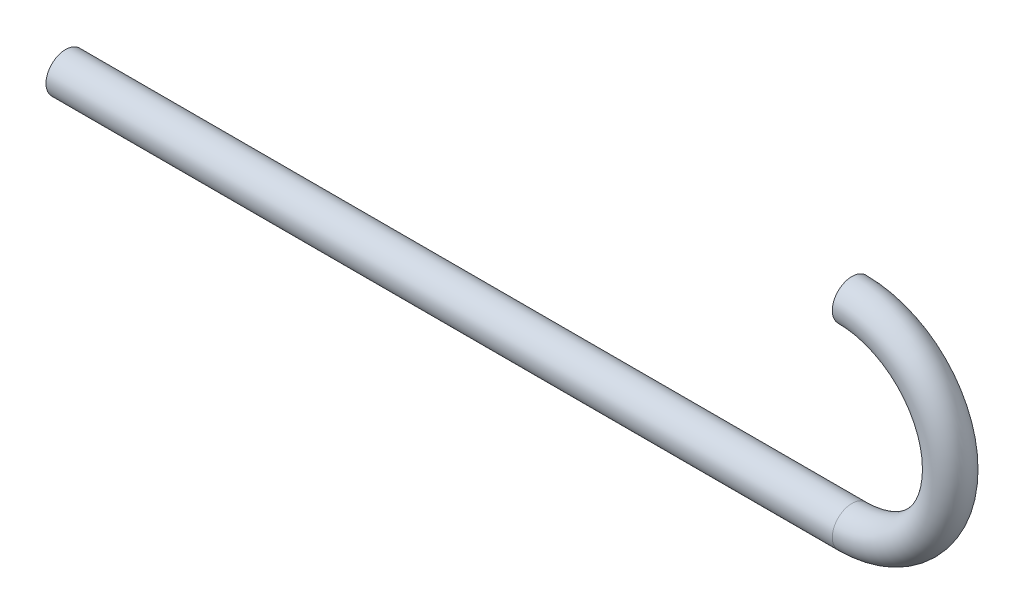
ISO-10303-21;
HEADER;
FILE_DESCRIPTION(('STEP AP214'),'2;1');
FILE_NAME('part.step','',(''),(''),'','','');
FILE_SCHEMA(('AUTOMOTIVE_DESIGN { 1 0 10303 214 1 1 1 1 }'));
ENDSEC;
DATA;
#1=APPLICATION_CONTEXT('core data for automotive mechanical design processes');
#2=APPLICATION_PROTOCOL_DEFINITION('international standard','automotive_design',2000,#1);
#3=PRODUCT_CONTEXT('',#1,'mechanical');
#4=PRODUCT('Part','Part','',(#3));
#5=PRODUCT_RELATED_PRODUCT_CATEGORY('part','',(#4));
#6=PRODUCT_DEFINITION_FORMATION('','',#4);
#7=PRODUCT_DEFINITION_CONTEXT('part definition',#1,'design');
#8=PRODUCT_DEFINITION('design','',#6,#7);
#9=PRODUCT_DEFINITION_SHAPE('','',#8);
#10=(LENGTH_UNIT() NAMED_UNIT(*) SI_UNIT(.MILLI.,.METRE.));
#11=(NAMED_UNIT(*) PLANE_ANGLE_UNIT() SI_UNIT($,.RADIAN.));
#12=(NAMED_UNIT(*) SI_UNIT($,.STERADIAN.) SOLID_ANGLE_UNIT());
#13=UNCERTAINTY_MEASURE_WITH_UNIT(LENGTH_MEASURE(1.E-05),#10,'distance_accuracy_value','');
#14=(GEOMETRIC_REPRESENTATION_CONTEXT(3) GLOBAL_UNCERTAINTY_ASSIGNED_CONTEXT((#13)) GLOBAL_UNIT_ASSIGNED_CONTEXT((#10,
#11,#12)) REPRESENTATION_CONTEXT('',''));
#15=CARTESIAN_POINT('',(0.,0.,0.));
#16=DIRECTION('',(0.,0.,1.));
#17=DIRECTION('',(1.,0.,0.));
#18=AXIS2_PLACEMENT_3D('',#15,#16,#17);
#19=CARTESIAN_POINT('',(120.,15.,0.));
#20=DIRECTION('',(0.,0.,1.));
#21=DIRECTION('',(1.,0.,0.));
#22=AXIS2_PLACEMENT_3D('',#19,#20,#21);
#23=TOROIDAL_SURFACE('',#22,15.,3.);
#24=CARTESIAN_POINT('',(120.,0.,0.));
#25=DIRECTION('',(1.,0.,0.));
#26=DIRECTION('',(0.,0.,-1.));
#27=AXIS2_PLACEMENT_3D('',#24,#25,#26);
#28=CIRCLE('',#27,3.);
#29=CARTESIAN_POINT('',(120.,-3.,0.));
#30=VERTEX_POINT('',#29);
#31=EDGE_CURVE('E39',#30,#30,#28,.T.);
#32=CARTESIAN_POINT('',(120.,30.,0.));
#33=DIRECTION('',(-1.,0.,0.));
#34=DIRECTION('',(0.,0.,-1.));
#35=AXIS2_PLACEMENT_3D('',#32,#33,#34);
#36=CIRCLE('',#35,3.);
#37=CARTESIAN_POINT('',(120.,33.,0.));
#38=VERTEX_POINT('',#37);
#39=EDGE_CURVE('E10',#38,#38,#36,.T.);
#40=CARTESIAN_POINT('',(120.,15.,0.));
#41=DIRECTION('',(0.,0.,1.));
#42=DIRECTION('',(1.,0.,0.));
#43=AXIS2_PLACEMENT_3D('',#40,#41,#42);
#44=CIRCLE('',#43,18.);
#45=EDGE_CURVE('',#30,#38,#44,.T.);
#46=ORIENTED_EDGE('',*,*,#31,.T.);
#47=ORIENTED_EDGE('',*,*,#39,.F.);
#48=ORIENTED_EDGE('',*,*,#45,.T.);
#49=ORIENTED_EDGE('',*,*,#45,.F.);
#50=EDGE_LOOP('',(#46,#48,#47,#49));
#51=FACE_BOUND('',#50,.T.);
#52=ADVANCED_FACE('F33',(#51),#23,.T.);
#53=CARTESIAN_POINT('',(120.,0.,0.));
#54=DIRECTION('',(-1.,0.,0.));
#55=DIRECTION('',(0.,0.,1.));
#56=AXIS2_PLACEMENT_3D('',#53,#54,#55);
#57=CYLINDRICAL_SURFACE('',#56,3.);
#58=ORIENTED_EDGE('',*,*,#31,.F.);
#59=EDGE_LOOP('',(#58));
#60=FACE_BOUND('',#59,.T.);
#61=CARTESIAN_POINT('',(0.,0.,0.));
#62=DIRECTION('',(1.,0.,0.));
#63=DIRECTION('',(0.,0.,-1.));
#64=AXIS2_PLACEMENT_3D('',#61,#62,#63);
#65=CIRCLE('',#64,3.);
#66=CARTESIAN_POINT('',(0.,0.,-3.));
#67=VERTEX_POINT('',#66);
#68=EDGE_CURVE('E43',#67,#67,#65,.T.);
#69=ORIENTED_EDGE('',*,*,#68,.T.);
#70=EDGE_LOOP('',(#69));
#71=FACE_BOUND('',#70,.T.);
#72=ADVANCED_FACE('F50',(#60,#71),#57,.T.);
#73=CARTESIAN_POINT('',(120.,30.,0.));
#74=DIRECTION('',(-1.,0.,0.));
#75=DIRECTION('',(0.,0.,-1.));
#76=AXIS2_PLACEMENT_3D('',#73,#74,#75);
#77=PLANE('',#76);
#78=ORIENTED_EDGE('',*,*,#39,.T.);
#79=EDGE_LOOP('',(#78));
#80=FACE_BOUND('',#79,.T.);
#81=ADVANCED_FACE('F54',(#80),#77,.T.);
#82=CARTESIAN_POINT('',(0.,0.,0.));
#83=DIRECTION('',(1.,0.,0.));
#84=DIRECTION('',(0.,0.,-1.));
#85=AXIS2_PLACEMENT_3D('',#82,#83,#84);
#86=PLANE('',#85);
#87=ORIENTED_EDGE('',*,*,#68,.F.);
#88=EDGE_LOOP('',(#87));
#89=FACE_BOUND('',#88,.T.);
#90=ADVANCED_FACE('F52',(#89),#86,.F.);
#91=CLOSED_SHELL('',(#52,#72,#81,#90));
#92=MANIFOLD_SOLID_BREP('B2',#91);
#93=ADVANCED_BREP_SHAPE_REPRESENTATION('',(#18,#92),#14);
#94=SHAPE_DEFINITION_REPRESENTATION(#9,#93);
ENDSEC;
END-ISO-10303-21;
